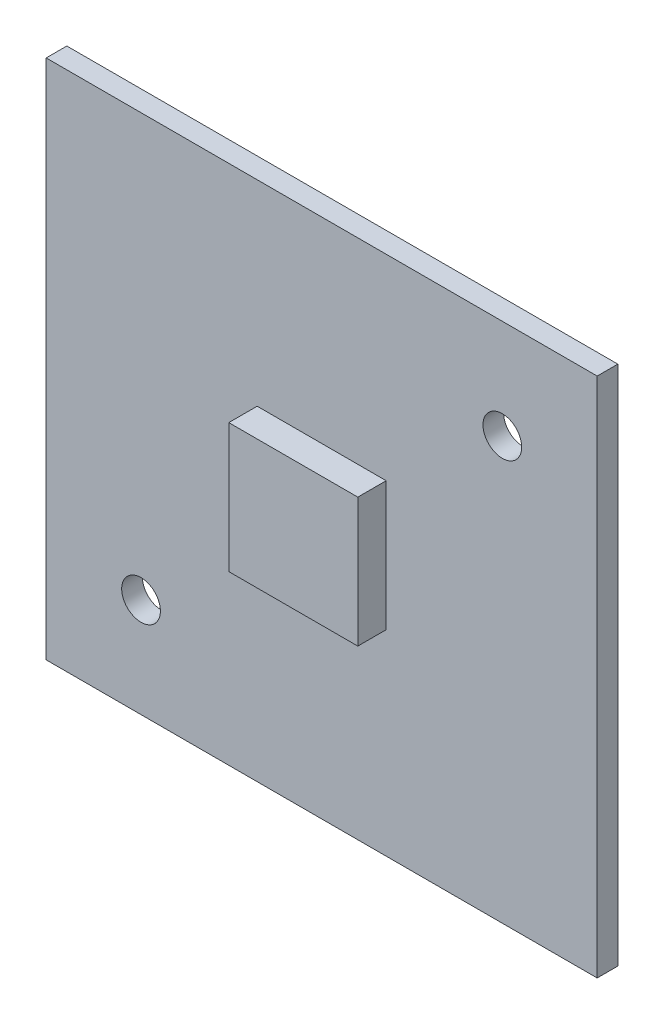
ISO-10303-21;
HEADER;
FILE_DESCRIPTION(('STEP AP214'),'2;1');
FILE_NAME('part.step','',(''),(''),'','','');
FILE_SCHEMA(('AUTOMOTIVE_DESIGN { 1 0 10303 214 1 1 1 1 }'));
ENDSEC;
DATA;
#1=APPLICATION_CONTEXT('core data for automotive mechanical design processes');
#2=APPLICATION_PROTOCOL_DEFINITION('international standard','automotive_design',2000,#1);
#3=PRODUCT_CONTEXT('',#1,'mechanical');
#4=PRODUCT('Part','Part','',(#3));
#5=PRODUCT_RELATED_PRODUCT_CATEGORY('part','',(#4));
#6=PRODUCT_DEFINITION_FORMATION('','',#4);
#7=PRODUCT_DEFINITION_CONTEXT('part definition',#1,'design');
#8=PRODUCT_DEFINITION('design','',#6,#7);
#9=PRODUCT_DEFINITION_SHAPE('','',#8);
#10=(LENGTH_UNIT() NAMED_UNIT(*) SI_UNIT(.MILLI.,.METRE.));
#11=(NAMED_UNIT(*) PLANE_ANGLE_UNIT() SI_UNIT($,.RADIAN.));
#12=(NAMED_UNIT(*) SI_UNIT($,.STERADIAN.) SOLID_ANGLE_UNIT());
#13=UNCERTAINTY_MEASURE_WITH_UNIT(LENGTH_MEASURE(1.E-05),#10,'distance_accuracy_value','');
#14=(GEOMETRIC_REPRESENTATION_CONTEXT(3) GLOBAL_UNCERTAINTY_ASSIGNED_CONTEXT((#13)) GLOBAL_UNIT_ASSIGNED_CONTEXT((#10,
#11,#12)) REPRESENTATION_CONTEXT('',''));
#15=CARTESIAN_POINT('',(0.,0.,0.));
#16=DIRECTION('',(0.,0.,1.));
#17=DIRECTION('',(1.,0.,0.));
#18=AXIS2_PLACEMENT_3D('',#15,#16,#17);
#19=CARTESIAN_POINT('',(0.,0.,-8.4));
#20=DIRECTION('',(0.,0.,-1.));
#21=DIRECTION('',(-1.,0.,0.));
#22=AXIS2_PLACEMENT_3D('',#19,#20,#21);
#23=PLANE('',#22);
#24=CARTESIAN_POINT('',(86.,57.5,-8.4));
#25=DIRECTION('',(0.,0.,1.));
#26=DIRECTION('',(1.,0.,0.));
#27=AXIS2_PLACEMENT_3D('',#24,#25,#26);
#28=CIRCLE('',#27,1.5);
#29=CARTESIAN_POINT('',(87.5,57.5,-8.4));
#30=VERTEX_POINT('',#29);
#31=EDGE_CURVE('E269',#30,#30,#28,.T.);
#32=ORIENTED_EDGE('',*,*,#31,.F.);
#33=EDGE_LOOP('',(#32));
#34=FACE_BOUND('',#33,.T.);
#35=CARTESIAN_POINT('',(114.,82.5,-8.4));
#36=DIRECTION('',(0.,0.,1.));
#37=DIRECTION('',(1.,0.,0.));
#38=AXIS2_PLACEMENT_3D('',#35,#36,#37);
#39=CIRCLE('',#38,1.5);
#40=CARTESIAN_POINT('',(115.5,82.5,-8.4));
#41=VERTEX_POINT('',#40);
#42=EDGE_CURVE('E267',#41,#41,#39,.T.);
#43=ORIENTED_EDGE('',*,*,#42,.F.);
#44=EDGE_LOOP('',(#43));
#45=FACE_BOUND('',#44,.T.);
#46=DIRECTION('',(0.,-1.,0.));
#47=VECTOR('',#46,1.);
#48=CARTESIAN_POINT('',(78.65,49.8,-8.4));
#49=LINE('',#48,#47);
#50=CARTESIAN_POINT('',(78.65,90.2,-8.4));
#51=VERTEX_POINT('',#50);
#52=CARTESIAN_POINT('',(78.65,49.8,-8.4));
#53=VERTEX_POINT('',#52);
#54=EDGE_CURVE('E132',#51,#53,#49,.T.);
#55=ORIENTED_EDGE('',*,*,#54,.T.);
#56=DIRECTION('',(1.,0.,0.));
#57=VECTOR('',#56,1.);
#58=CARTESIAN_POINT('',(78.65,49.8,-8.4));
#59=LINE('',#58,#57);
#60=CARTESIAN_POINT('',(121.35,49.8,-8.4));
#61=VERTEX_POINT('',#60);
#62=EDGE_CURVE('E137',#53,#61,#59,.T.);
#63=ORIENTED_EDGE('',*,*,#62,.T.);
#64=DIRECTION('',(0.,1.,0.));
#65=VECTOR('',#64,1.);
#66=CARTESIAN_POINT('',(121.35,49.8,-8.4));
#67=LINE('',#66,#65);
#68=CARTESIAN_POINT('',(121.35,90.2,-8.4));
#69=VERTEX_POINT('',#68);
#70=EDGE_CURVE('E142',#61,#69,#67,.T.);
#71=ORIENTED_EDGE('',*,*,#70,.T.);
#72=DIRECTION('',(-1.,0.,0.));
#73=VECTOR('',#72,1.);
#74=CARTESIAN_POINT('',(78.65,90.2,-8.4));
#75=LINE('',#74,#73);
#76=EDGE_CURVE('E141',#69,#51,#75,.T.);
#77=ORIENTED_EDGE('',*,*,#76,.T.);
#78=EDGE_LOOP('',(#55,#63,#71,#77));
#79=FACE_BOUND('',#78,.T.);
#80=DIRECTION('',(0.,-1.,0.));
#81=VECTOR('',#80,1.);
#82=CARTESIAN_POINT('',(95.,65.,-8.4));
#83=LINE('',#82,#81);
#84=CARTESIAN_POINT('',(95.,75.,-8.4));
#85=VERTEX_POINT('',#84);
#86=CARTESIAN_POINT('',(95.,65.,-8.4));
#87=VERTEX_POINT('',#86);
#88=EDGE_CURVE('E57',#85,#87,#83,.T.);
#89=ORIENTED_EDGE('',*,*,#88,.F.);
#90=DIRECTION('',(-1.,0.,0.));
#91=VECTOR('',#90,1.);
#92=CARTESIAN_POINT('',(95.,75.,-8.4));
#93=LINE('',#92,#91);
#94=CARTESIAN_POINT('',(105.,75.,-8.4));
#95=VERTEX_POINT('',#94);
#96=EDGE_CURVE('E58',#95,#85,#93,.T.);
#97=ORIENTED_EDGE('',*,*,#96,.F.);
#98=DIRECTION('',(0.,1.,0.));
#99=VECTOR('',#98,1.);
#100=CARTESIAN_POINT('',(105.,65.,-8.4));
#101=LINE('',#100,#99);
#102=CARTESIAN_POINT('',(105.,65.,-8.4));
#103=VERTEX_POINT('',#102);
#104=EDGE_CURVE('E285',#103,#95,#101,.T.);
#105=ORIENTED_EDGE('',*,*,#104,.F.);
#106=DIRECTION('',(1.,0.,0.));
#107=VECTOR('',#106,1.);
#108=CARTESIAN_POINT('',(95.,65.,-8.4));
#109=LINE('',#108,#107);
#110=EDGE_CURVE('E284',#87,#103,#109,.T.);
#111=ORIENTED_EDGE('',*,*,#110,.F.);
#112=EDGE_LOOP('',(#89,#97,#105,#111));
#113=FACE_BOUND('',#112,.T.);
#114=ADVANCED_FACE('F41',(#34,#45,#79,#113),#23,.F.);
#115=CARTESIAN_POINT('',(78.65,49.8,-8.4));
#116=DIRECTION('',(1.,0.,0.));
#117=DIRECTION('',(0.,0.,-1.));
#118=AXIS2_PLACEMENT_3D('',#115,#116,#117);
#119=PLANE('',#118);
#120=DIRECTION('',(0.,-1.,0.));
#121=VECTOR('',#120,1.);
#122=CARTESIAN_POINT('',(78.65,49.8,-10.));
#123=LINE('',#122,#121);
#124=CARTESIAN_POINT('',(78.65,90.2,-10.));
#125=VERTEX_POINT('',#124);
#126=CARTESIAN_POINT('',(78.65,49.8,-10.));
#127=VERTEX_POINT('',#126);
#128=EDGE_CURVE('E128',#125,#127,#123,.T.);
#129=ORIENTED_EDGE('',*,*,#128,.T.);
#130=DIRECTION('',(0.,0.,-1.));
#131=VECTOR('',#130,1.);
#132=CARTESIAN_POINT('',(78.65,49.8,-8.4));
#133=LINE('',#132,#131);
#134=EDGE_CURVE('E11',#53,#127,#133,.T.);
#135=ORIENTED_EDGE('',*,*,#134,.F.);
#136=ORIENTED_EDGE('',*,*,#54,.F.);
#137=DIRECTION('',(0.,0.,-1.));
#138=VECTOR('',#137,1.);
#139=CARTESIAN_POINT('',(78.65,90.2,-8.4));
#140=LINE('',#139,#138);
#141=EDGE_CURVE('E144',#51,#125,#140,.T.);
#142=ORIENTED_EDGE('',*,*,#141,.T.);
#143=EDGE_LOOP('',(#129,#135,#136,#142));
#144=FACE_BOUND('',#143,.T.);
#145=ADVANCED_FACE('F43',(#144),#119,.F.);
#146=CARTESIAN_POINT('',(78.65,49.8,-8.4));
#147=DIRECTION('',(0.,1.,0.));
#148=DIRECTION('',(0.,0.,1.));
#149=AXIS2_PLACEMENT_3D('',#146,#147,#148);
#150=PLANE('',#149);
#151=DIRECTION('',(1.,0.,0.));
#152=VECTOR('',#151,1.);
#153=CARTESIAN_POINT('',(78.65,49.8,-10.));
#154=LINE('',#153,#152);
#155=CARTESIAN_POINT('',(121.35,49.8,-10.));
#156=VERTEX_POINT('',#155);
#157=EDGE_CURVE('E129',#127,#156,#154,.T.);
#158=ORIENTED_EDGE('',*,*,#157,.T.);
#159=DIRECTION('',(0.,0.,-1.));
#160=VECTOR('',#159,1.);
#161=CARTESIAN_POINT('',(121.35,49.8,-8.4));
#162=LINE('',#161,#160);
#163=EDGE_CURVE('E47',#61,#156,#162,.T.);
#164=ORIENTED_EDGE('',*,*,#163,.F.);
#165=ORIENTED_EDGE('',*,*,#62,.F.);
#166=ORIENTED_EDGE('',*,*,#134,.T.);
#167=EDGE_LOOP('',(#158,#164,#165,#166));
#168=FACE_BOUND('',#167,.T.);
#169=ADVANCED_FACE('F172',(#168),#150,.F.);
#170=CARTESIAN_POINT('',(121.35,49.8,-8.4));
#171=DIRECTION('',(-1.,0.,0.));
#172=DIRECTION('',(0.,0.,1.));
#173=AXIS2_PLACEMENT_3D('',#170,#171,#172);
#174=PLANE('',#173);
#175=DIRECTION('',(0.,1.,0.));
#176=VECTOR('',#175,1.);
#177=CARTESIAN_POINT('',(121.35,49.8,-10.));
#178=LINE('',#177,#176);
#179=CARTESIAN_POINT('',(121.35,90.2,-10.));
#180=VERTEX_POINT('',#179);
#181=EDGE_CURVE('E150',#156,#180,#178,.T.);
#182=ORIENTED_EDGE('',*,*,#181,.T.);
#183=DIRECTION('',(0.,0.,-1.));
#184=VECTOR('',#183,1.);
#185=CARTESIAN_POINT('',(121.35,90.2,-8.4));
#186=LINE('',#185,#184);
#187=EDGE_CURVE('E151',#69,#180,#186,.T.);
#188=ORIENTED_EDGE('',*,*,#187,.F.);
#189=ORIENTED_EDGE('',*,*,#70,.F.);
#190=ORIENTED_EDGE('',*,*,#163,.T.);
#191=EDGE_LOOP('',(#182,#188,#189,#190));
#192=FACE_BOUND('',#191,.T.);
#193=ADVANCED_FACE('F160',(#192),#174,.F.);
#194=CARTESIAN_POINT('',(78.65,90.2,-8.4));
#195=DIRECTION('',(0.,-1.,0.));
#196=DIRECTION('',(0.,0.,-1.));
#197=AXIS2_PLACEMENT_3D('',#194,#195,#196);
#198=PLANE('',#197);
#199=DIRECTION('',(-1.,0.,0.));
#200=VECTOR('',#199,1.);
#201=CARTESIAN_POINT('',(78.65,90.2,-10.));
#202=LINE('',#201,#200);
#203=EDGE_CURVE('E140',#180,#125,#202,.T.);
#204=ORIENTED_EDGE('',*,*,#203,.T.);
#205=ORIENTED_EDGE('',*,*,#141,.F.);
#206=ORIENTED_EDGE('',*,*,#76,.F.);
#207=ORIENTED_EDGE('',*,*,#187,.T.);
#208=EDGE_LOOP('',(#204,#205,#206,#207));
#209=FACE_BOUND('',#208,.T.);
#210=ADVANCED_FACE('F166',(#209),#198,.F.);
#211=CARTESIAN_POINT('',(0.,0.,-10.));
#212=DIRECTION('',(0.,0.,-1.));
#213=DIRECTION('',(-1.,0.,0.));
#214=AXIS2_PLACEMENT_3D('',#211,#212,#213);
#215=PLANE('',#214);
#216=CARTESIAN_POINT('',(86.,57.5,-10.));
#217=DIRECTION('',(0.,0.,1.));
#218=DIRECTION('',(1.,0.,0.));
#219=AXIS2_PLACEMENT_3D('',#216,#217,#218);
#220=CIRCLE('',#219,1.5);
#221=CARTESIAN_POINT('',(87.5,57.5,-10.));
#222=VERTEX_POINT('',#221);
#223=EDGE_CURVE('E262',#222,#222,#220,.T.);
#224=ORIENTED_EDGE('',*,*,#223,.T.);
#225=EDGE_LOOP('',(#224));
#226=FACE_BOUND('',#225,.T.);
#227=CARTESIAN_POINT('',(114.,82.5,-10.));
#228=DIRECTION('',(0.,0.,1.));
#229=DIRECTION('',(1.,0.,0.));
#230=AXIS2_PLACEMENT_3D('',#227,#228,#229);
#231=CIRCLE('',#230,1.5);
#232=CARTESIAN_POINT('',(115.5,82.5,-10.));
#233=VERTEX_POINT('',#232);
#234=EDGE_CURVE('E275',#233,#233,#231,.T.);
#235=ORIENTED_EDGE('',*,*,#234,.T.);
#236=EDGE_LOOP('',(#235));
#237=FACE_BOUND('',#236,.T.);
#238=ORIENTED_EDGE('',*,*,#128,.F.);
#239=ORIENTED_EDGE('',*,*,#203,.F.);
#240=ORIENTED_EDGE('',*,*,#181,.F.);
#241=ORIENTED_EDGE('',*,*,#157,.F.);
#242=EDGE_LOOP('',(#238,#239,#240,#241));
#243=FACE_BOUND('',#242,.T.);
#244=ADVANCED_FACE('F164',(#226,#237,#243),#215,.T.);
#245=CARTESIAN_POINT('',(95.,65.,-6.2));
#246=DIRECTION('',(1.,0.,0.));
#247=DIRECTION('',(0.,0.,-1.));
#248=AXIS2_PLACEMENT_3D('',#245,#246,#247);
#249=PLANE('',#248);
#250=ORIENTED_EDGE('',*,*,#88,.T.);
#251=DIRECTION('',(0.,0.,-1.));
#252=VECTOR('',#251,1.);
#253=CARTESIAN_POINT('',(95.,65.,-6.2));
#254=LINE('',#253,#252);
#255=CARTESIAN_POINT('',(95.,65.,-6.2));
#256=VERTEX_POINT('',#255);
#257=EDGE_CURVE('E107',#256,#87,#254,.T.);
#258=ORIENTED_EDGE('',*,*,#257,.F.);
#259=DIRECTION('',(0.,-1.,0.));
#260=VECTOR('',#259,1.);
#261=CARTESIAN_POINT('',(95.,65.,-6.2));
#262=LINE('',#261,#260);
#263=CARTESIAN_POINT('',(95.,75.,-6.2));
#264=VERTEX_POINT('',#263);
#265=EDGE_CURVE('E114',#264,#256,#262,.T.);
#266=ORIENTED_EDGE('',*,*,#265,.F.);
#267=DIRECTION('',(0.,0.,-1.));
#268=VECTOR('',#267,1.);
#269=CARTESIAN_POINT('',(95.,75.,-6.2));
#270=LINE('',#269,#268);
#271=EDGE_CURVE('E279',#264,#85,#270,.T.);
#272=ORIENTED_EDGE('',*,*,#271,.T.);
#273=EDGE_LOOP('',(#250,#258,#266,#272));
#274=FACE_BOUND('',#273,.T.);
#275=ADVANCED_FACE('F123',(#274),#249,.F.);
#276=CARTESIAN_POINT('',(95.,65.,-6.2));
#277=DIRECTION('',(0.,1.,0.));
#278=DIRECTION('',(0.,0.,1.));
#279=AXIS2_PLACEMENT_3D('',#276,#277,#278);
#280=PLANE('',#279);
#281=ORIENTED_EDGE('',*,*,#110,.T.);
#282=DIRECTION('',(0.,0.,-1.));
#283=VECTOR('',#282,1.);
#284=CARTESIAN_POINT('',(105.,65.,-6.2));
#285=LINE('',#284,#283);
#286=CARTESIAN_POINT('',(105.,65.,-6.2));
#287=VERTEX_POINT('',#286);
#288=EDGE_CURVE('E111',#287,#103,#285,.T.);
#289=ORIENTED_EDGE('',*,*,#288,.F.);
#290=DIRECTION('',(1.,0.,0.));
#291=VECTOR('',#290,1.);
#292=CARTESIAN_POINT('',(95.,65.,-6.2));
#293=LINE('',#292,#291);
#294=EDGE_CURVE('E104',#256,#287,#293,.T.);
#295=ORIENTED_EDGE('',*,*,#294,.F.);
#296=ORIENTED_EDGE('',*,*,#257,.T.);
#297=EDGE_LOOP('',(#281,#289,#295,#296));
#298=FACE_BOUND('',#297,.T.);
#299=ADVANCED_FACE('F110',(#298),#280,.F.);
#300=CARTESIAN_POINT('',(105.,65.,-6.2));
#301=DIRECTION('',(-1.,0.,0.));
#302=DIRECTION('',(0.,0.,1.));
#303=AXIS2_PLACEMENT_3D('',#300,#301,#302);
#304=PLANE('',#303);
#305=ORIENTED_EDGE('',*,*,#104,.T.);
#306=DIRECTION('',(0.,0.,-1.));
#307=VECTOR('',#306,1.);
#308=CARTESIAN_POINT('',(105.,75.,-6.2));
#309=LINE('',#308,#307);
#310=CARTESIAN_POINT('',(105.,75.,-6.2));
#311=VERTEX_POINT('',#310);
#312=EDGE_CURVE('E134',#311,#95,#309,.T.);
#313=ORIENTED_EDGE('',*,*,#312,.F.);
#314=DIRECTION('',(0.,1.,0.));
#315=VECTOR('',#314,1.);
#316=CARTESIAN_POINT('',(105.,65.,-6.2));
#317=LINE('',#316,#315);
#318=EDGE_CURVE('E112',#287,#311,#317,.T.);
#319=ORIENTED_EDGE('',*,*,#318,.F.);
#320=ORIENTED_EDGE('',*,*,#288,.T.);
#321=EDGE_LOOP('',(#305,#313,#319,#320));
#322=FACE_BOUND('',#321,.T.);
#323=ADVANCED_FACE('F212',(#322),#304,.F.);
#324=CARTESIAN_POINT('',(95.,75.,-6.2));
#325=DIRECTION('',(0.,-1.,0.));
#326=DIRECTION('',(0.,0.,-1.));
#327=AXIS2_PLACEMENT_3D('',#324,#325,#326);
#328=PLANE('',#327);
#329=ORIENTED_EDGE('',*,*,#96,.T.);
#330=ORIENTED_EDGE('',*,*,#271,.F.);
#331=DIRECTION('',(-1.,0.,0.));
#332=VECTOR('',#331,1.);
#333=CARTESIAN_POINT('',(95.,75.,-6.2));
#334=LINE('',#333,#332);
#335=EDGE_CURVE('E119',#311,#264,#334,.T.);
#336=ORIENTED_EDGE('',*,*,#335,.F.);
#337=ORIENTED_EDGE('',*,*,#312,.T.);
#338=EDGE_LOOP('',(#329,#330,#336,#337));
#339=FACE_BOUND('',#338,.T.);
#340=ADVANCED_FACE('F224',(#339),#328,.F.);
#341=CARTESIAN_POINT('',(0.,0.,-6.2));
#342=DIRECTION('',(0.,0.,-1.));
#343=DIRECTION('',(-1.,0.,0.));
#344=AXIS2_PLACEMENT_3D('',#341,#342,#343);
#345=PLANE('',#344);
#346=ORIENTED_EDGE('',*,*,#265,.T.);
#347=ORIENTED_EDGE('',*,*,#294,.T.);
#348=ORIENTED_EDGE('',*,*,#318,.T.);
#349=ORIENTED_EDGE('',*,*,#335,.T.);
#350=EDGE_LOOP('',(#346,#347,#348,#349));
#351=FACE_BOUND('',#350,.T.);
#352=ADVANCED_FACE('F117',(#351),#345,.F.);
#353=CARTESIAN_POINT('',(114.,82.5,-10.));
#354=DIRECTION('',(0.,0.,1.));
#355=DIRECTION('',(1.,0.,0.));
#356=AXIS2_PLACEMENT_3D('',#353,#354,#355);
#357=CYLINDRICAL_SURFACE('',#356,1.5);
#358=ORIENTED_EDGE('',*,*,#234,.F.);
#359=EDGE_LOOP('',(#358));
#360=FACE_BOUND('',#359,.T.);
#361=ORIENTED_EDGE('',*,*,#42,.T.);
#362=EDGE_LOOP('',(#361));
#363=FACE_BOUND('',#362,.T.);
#364=ADVANCED_FACE('F240',(#360,#363),#357,.F.);
#365=CARTESIAN_POINT('',(86.,57.5,-10.));
#366=DIRECTION('',(0.,0.,1.));
#367=DIRECTION('',(1.,0.,0.));
#368=AXIS2_PLACEMENT_3D('',#365,#366,#367);
#369=CYLINDRICAL_SURFACE('',#368,1.5);
#370=ORIENTED_EDGE('',*,*,#223,.F.);
#371=EDGE_LOOP('',(#370));
#372=FACE_BOUND('',#371,.T.);
#373=ORIENTED_EDGE('',*,*,#31,.T.);
#374=EDGE_LOOP('',(#373));
#375=FACE_BOUND('',#374,.T.);
#376=ADVANCED_FACE('F248',(#372,#375),#369,.F.);
#377=CLOSED_SHELL('',(#114,#145,#169,#193,#210,#244,#275,#299,#323,#340,#352,#364,#376));
#378=MANIFOLD_SOLID_BREP('B2',#377);
#379=ADVANCED_BREP_SHAPE_REPRESENTATION('',(#18,#378),#14);
#380=SHAPE_DEFINITION_REPRESENTATION(#9,#379);
ENDSEC;
END-ISO-10303-21;
